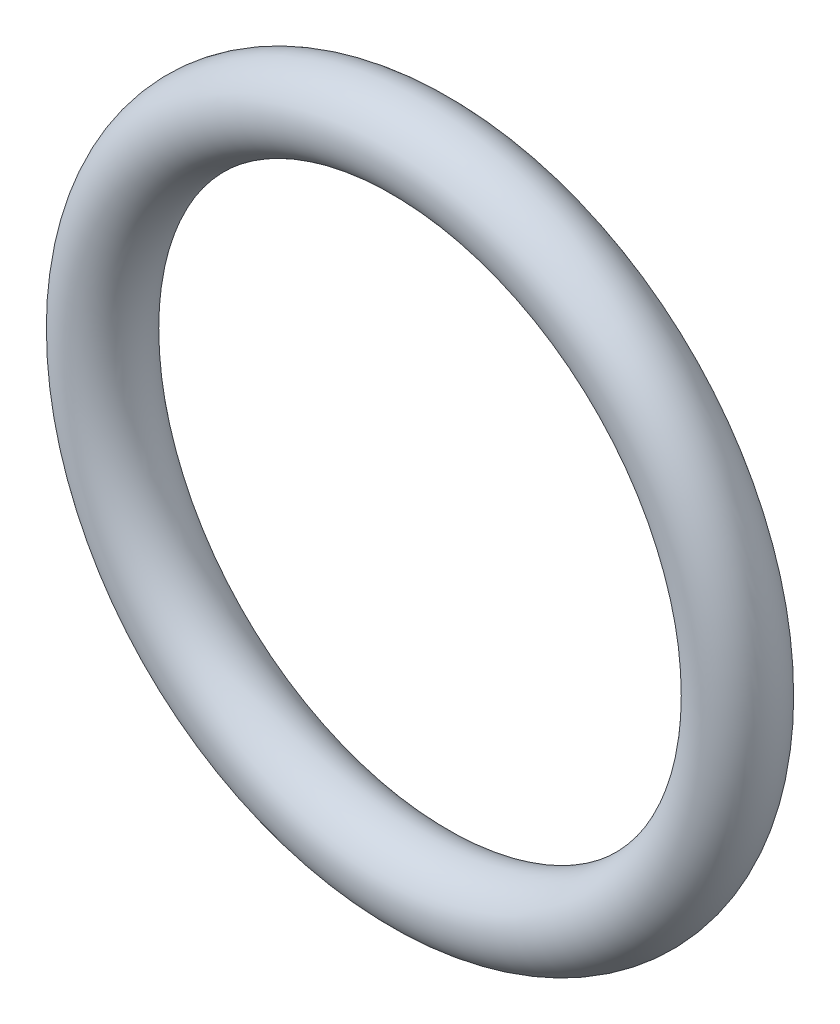
ISO-10303-21;
HEADER;
FILE_DESCRIPTION(('STEP AP214'),'2;1');
FILE_NAME('part.step','',(''),(''),'','','');
FILE_SCHEMA(('AUTOMOTIVE_DESIGN { 1 0 10303 214 1 1 1 1 }'));
ENDSEC;
DATA;
#1=APPLICATION_CONTEXT('core data for automotive mechanical design processes');
#2=APPLICATION_PROTOCOL_DEFINITION('international standard','automotive_design',2000,#1);
#3=PRODUCT_CONTEXT('',#1,'mechanical');
#4=PRODUCT('Part','Part','',(#3));
#5=PRODUCT_RELATED_PRODUCT_CATEGORY('part','',(#4));
#6=PRODUCT_DEFINITION_FORMATION('','',#4);
#7=PRODUCT_DEFINITION_CONTEXT('part definition',#1,'design');
#8=PRODUCT_DEFINITION('design','',#6,#7);
#9=PRODUCT_DEFINITION_SHAPE('','',#8);
#10=(LENGTH_UNIT() NAMED_UNIT(*) SI_UNIT(.MILLI.,.METRE.));
#11=(NAMED_UNIT(*) PLANE_ANGLE_UNIT() SI_UNIT($,.RADIAN.));
#12=(NAMED_UNIT(*) SI_UNIT($,.STERADIAN.) SOLID_ANGLE_UNIT());
#13=UNCERTAINTY_MEASURE_WITH_UNIT(LENGTH_MEASURE(1.E-05),#10,'distance_accuracy_value','');
#14=(GEOMETRIC_REPRESENTATION_CONTEXT(3) GLOBAL_UNCERTAINTY_ASSIGNED_CONTEXT((#13)) GLOBAL_UNIT_ASSIGNED_CONTEXT((#10,
#11,#12)) REPRESENTATION_CONTEXT('',''));
#15=CARTESIAN_POINT('',(0.,0.,0.));
#16=DIRECTION('',(0.,0.,1.));
#17=DIRECTION('',(1.,0.,0.));
#18=AXIS2_PLACEMENT_3D('',#15,#16,#17);
#19=CARTESIAN_POINT('',(0.,0.,0.));
#20=DIRECTION('',(0.,0.,1.));
#21=DIRECTION('',(1.,0.,0.));
#22=AXIS2_PLACEMENT_3D('',#19,#20,#21);
#23=TOROIDAL_SURFACE('',#22,7.0993,0.888999999999998);
#24=CARTESIAN_POINT('',(7.9883,0.,0.));
#25=VERTEX_POINT('',#24);
#26=VERTEX_LOOP('',#25);
#27=FACE_BOUND('',#26,.T.);
#28=ADVANCED_FACE('F28',(#27),#23,.T.);
#29=CLOSED_SHELL('',(#28));
#30=MANIFOLD_SOLID_BREP('B2',#29);
#31=ADVANCED_BREP_SHAPE_REPRESENTATION('',(#18,#30),#14);
#32=SHAPE_DEFINITION_REPRESENTATION(#9,#31);
ENDSEC;
END-ISO-10303-21;
